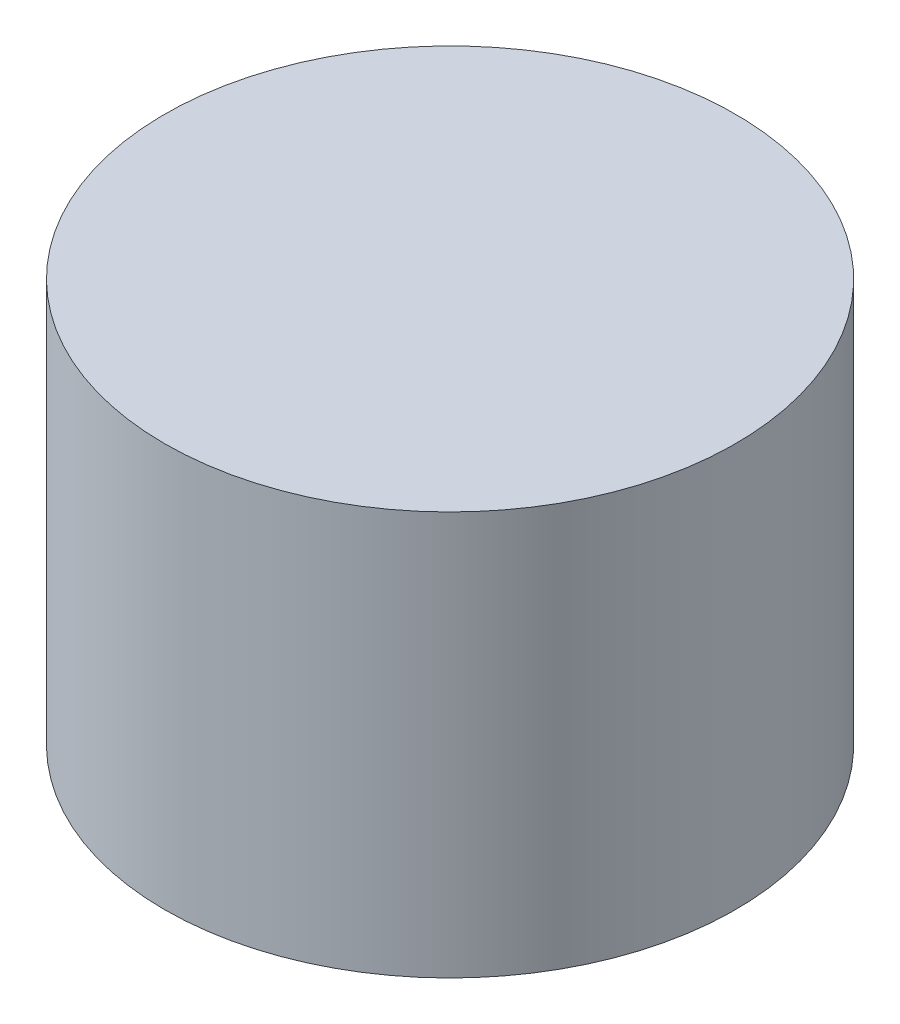
ISO-10303-21;
HEADER;
FILE_DESCRIPTION(('STEP AP214'),'2;1');
FILE_NAME('part.step','',(''),(''),'','','');
FILE_SCHEMA(('AUTOMOTIVE_DESIGN { 1 0 10303 214 1 1 1 1 }'));
ENDSEC;
DATA;
#1=APPLICATION_CONTEXT('core data for automotive mechanical design processes');
#2=APPLICATION_PROTOCOL_DEFINITION('international standard','automotive_design',2000,#1);
#3=PRODUCT_CONTEXT('',#1,'mechanical');
#4=PRODUCT('Part','Part','',(#3));
#5=PRODUCT_RELATED_PRODUCT_CATEGORY('part','',(#4));
#6=PRODUCT_DEFINITION_FORMATION('','',#4);
#7=PRODUCT_DEFINITION_CONTEXT('part definition',#1,'design');
#8=PRODUCT_DEFINITION('design','',#6,#7);
#9=PRODUCT_DEFINITION_SHAPE('','',#8);
#10=(LENGTH_UNIT() NAMED_UNIT(*) SI_UNIT(.MILLI.,.METRE.));
#11=(NAMED_UNIT(*) PLANE_ANGLE_UNIT() SI_UNIT($,.RADIAN.));
#12=(NAMED_UNIT(*) SI_UNIT($,.STERADIAN.) SOLID_ANGLE_UNIT());
#13=UNCERTAINTY_MEASURE_WITH_UNIT(LENGTH_MEASURE(1.E-05),#10,'distance_accuracy_value','');
#14=(GEOMETRIC_REPRESENTATION_CONTEXT(3) GLOBAL_UNCERTAINTY_ASSIGNED_CONTEXT((#13)) GLOBAL_UNIT_ASSIGNED_CONTEXT((#10,
#11,#12)) REPRESENTATION_CONTEXT('',''));
#15=CARTESIAN_POINT('',(0.,0.,0.));
#16=DIRECTION('',(0.,0.,1.));
#17=DIRECTION('',(1.,0.,0.));
#18=AXIS2_PLACEMENT_3D('',#15,#16,#17);
#19=CARTESIAN_POINT('',(0.,1.4,0.));
#20=DIRECTION('',(0.,-1.,0.));
#21=DIRECTION('',(0.,0.,-1.));
#22=AXIS2_PLACEMENT_3D('',#19,#20,#21);
#23=CYLINDRICAL_SURFACE('',#22,0.99);
#24=CARTESIAN_POINT('',(0.,1.4,0.));
#25=DIRECTION('',(0.,1.,0.));
#26=DIRECTION('',(0.,0.,1.));
#27=AXIS2_PLACEMENT_3D('',#24,#25,#26);
#28=CIRCLE('',#27,0.99);
#29=CARTESIAN_POINT('',(0.,1.4,0.99));
#30=VERTEX_POINT('',#29);
#31=EDGE_CURVE('E10',#30,#30,#28,.T.);
#32=ORIENTED_EDGE('',*,*,#31,.F.);
#33=EDGE_LOOP('',(#32));
#34=FACE_BOUND('',#33,.T.);
#35=CARTESIAN_POINT('',(0.,0.,0.));
#36=DIRECTION('',(0.,1.,0.));
#37=DIRECTION('',(0.,0.,1.));
#38=AXIS2_PLACEMENT_3D('',#35,#36,#37);
#39=CIRCLE('',#38,0.99);
#40=CARTESIAN_POINT('',(0.,0.,0.99));
#41=VERTEX_POINT('',#40);
#42=EDGE_CURVE('E37',#41,#41,#39,.T.);
#43=ORIENTED_EDGE('',*,*,#42,.T.);
#44=EDGE_LOOP('',(#43));
#45=FACE_BOUND('',#44,.T.);
#46=ADVANCED_FACE('F34',(#34,#45),#23,.T.);
#47=CARTESIAN_POINT('',(0.,1.4,0.));
#48=DIRECTION('',(0.,1.,0.));
#49=DIRECTION('',(0.,0.,1.));
#50=AXIS2_PLACEMENT_3D('',#47,#48,#49);
#51=PLANE('',#50);
#52=ORIENTED_EDGE('',*,*,#31,.T.);
#53=EDGE_LOOP('',(#52));
#54=FACE_BOUND('',#53,.T.);
#55=ADVANCED_FACE('F49',(#54),#51,.T.);
#56=CARTESIAN_POINT('',(0.,0.,0.));
#57=DIRECTION('',(0.,1.,0.));
#58=DIRECTION('',(0.,0.,1.));
#59=AXIS2_PLACEMENT_3D('',#56,#57,#58);
#60=PLANE('',#59);
#61=ORIENTED_EDGE('',*,*,#42,.F.);
#62=EDGE_LOOP('',(#61));
#63=FACE_BOUND('',#62,.T.);
#64=ADVANCED_FACE('F47',(#63),#60,.F.);
#65=CLOSED_SHELL('',(#46,#55,#64));
#66=MANIFOLD_SOLID_BREP('B2',#65);
#67=ADVANCED_BREP_SHAPE_REPRESENTATION('',(#18,#66),#14);
#68=SHAPE_DEFINITION_REPRESENTATION(#9,#67);
ENDSEC;
END-ISO-10303-21;
